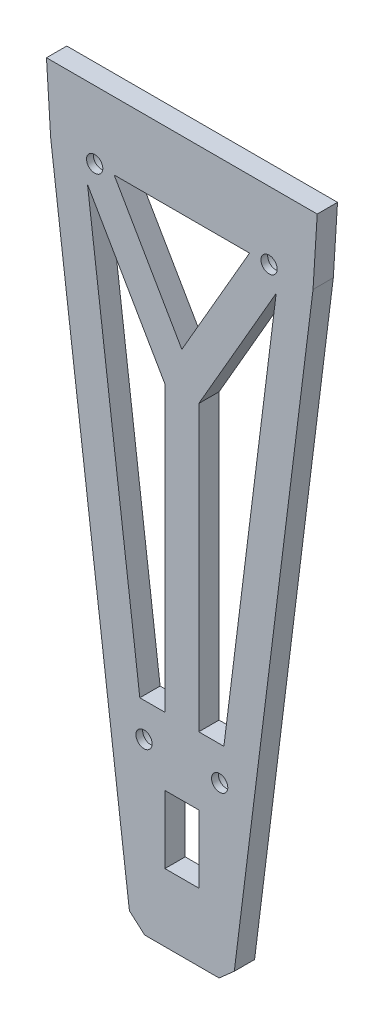
ISO-10303-21;
HEADER;
FILE_DESCRIPTION(('STEP AP214'),'2;1');
FILE_NAME('part.step','',(''),(''),'','','');
FILE_SCHEMA(('AUTOMOTIVE_DESIGN { 1 0 10303 214 1 1 1 1 }'));
ENDSEC;
DATA;
#1=APPLICATION_CONTEXT('core data for automotive mechanical design processes');
#2=APPLICATION_PROTOCOL_DEFINITION('international standard','automotive_design',2000,#1);
#3=PRODUCT_CONTEXT('',#1,'mechanical');
#4=PRODUCT('Part','Part','',(#3));
#5=PRODUCT_RELATED_PRODUCT_CATEGORY('part','',(#4));
#6=PRODUCT_DEFINITION_FORMATION('','',#4);
#7=PRODUCT_DEFINITION_CONTEXT('part definition',#1,'design');
#8=PRODUCT_DEFINITION('design','',#6,#7);
#9=PRODUCT_DEFINITION_SHAPE('','',#8);
#10=(LENGTH_UNIT() NAMED_UNIT(*) SI_UNIT(.MILLI.,.METRE.));
#11=(NAMED_UNIT(*) PLANE_ANGLE_UNIT() SI_UNIT($,.RADIAN.));
#12=(NAMED_UNIT(*) SI_UNIT($,.STERADIAN.) SOLID_ANGLE_UNIT());
#13=UNCERTAINTY_MEASURE_WITH_UNIT(LENGTH_MEASURE(1.E-05),#10,'distance_accuracy_value','');
#14=(GEOMETRIC_REPRESENTATION_CONTEXT(3) GLOBAL_UNCERTAINTY_ASSIGNED_CONTEXT((#13)) GLOBAL_UNIT_ASSIGNED_CONTEXT((#10,
#11,#12)) REPRESENTATION_CONTEXT('',''));
#15=CARTESIAN_POINT('',(0.,0.,0.));
#16=DIRECTION('',(0.,0.,1.));
#17=DIRECTION('',(1.,0.,0.));
#18=AXIS2_PLACEMENT_3D('',#15,#16,#17);
#19=CARTESIAN_POINT('',(-19.3798263270539,-4.96138938357014,3.));
#20=DIRECTION('',(0.99806760209759,0.0621374415563304,0.));
#21=DIRECTION('',(-0.0621374415563304,0.99806760209759,0.));
#22=AXIS2_PLACEMENT_3D('',#19,#20,#21);
#23=PLANE('',#22);
#24=DIRECTION('',(0.0621374415563304,-0.99806760209759,0.));
#25=VECTOR('',#24,1.);
#26=CARTESIAN_POINT('',(-19.3798263270539,-4.96138938357014,0.));
#27=LINE('',#26,#25);
#28=CARTESIAN_POINT('',(-20.0000000000001,5.,0.));
#29=VERTEX_POINT('',#28);
#30=CARTESIAN_POINT('',(-19.3798263270539,-4.96138938357014,0.));
#31=VERTEX_POINT('',#30);
#32=EDGE_CURVE('E202',#29,#31,#27,.T.);
#33=ORIENTED_EDGE('',*,*,#32,.T.);
#34=DIRECTION('',(0.,0.,-1.));
#35=VECTOR('',#34,1.);
#36=CARTESIAN_POINT('',(-19.3798263270539,-4.96138938357014,3.));
#37=LINE('',#36,#35);
#38=CARTESIAN_POINT('',(-19.3798263270539,-4.96138938357014,3.));
#39=VERTEX_POINT('',#38);
#40=EDGE_CURVE('E40',#39,#31,#37,.T.);
#41=ORIENTED_EDGE('',*,*,#40,.F.);
#42=DIRECTION('',(0.0621374415563304,-0.99806760209759,0.));
#43=VECTOR('',#42,1.);
#44=CARTESIAN_POINT('',(-19.3798263270539,-4.96138938357014,3.));
#45=LINE('',#44,#43);
#46=CARTESIAN_POINT('',(-20.0000000000001,5.,3.));
#47=VERTEX_POINT('',#46);
#48=EDGE_CURVE('E204',#47,#39,#45,.T.);
#49=ORIENTED_EDGE('',*,*,#48,.F.);
#50=DIRECTION('',(0.,0.,-1.));
#51=VECTOR('',#50,1.);
#52=CARTESIAN_POINT('',(-20.,4.99999999999819,3.));
#53=LINE('',#52,#51);
#54=EDGE_CURVE('E11',#47,#29,#53,.T.);
#55=ORIENTED_EDGE('',*,*,#54,.T.);
#56=EDGE_LOOP('',(#33,#41,#49,#55));
#57=FACE_BOUND('',#56,.T.);
#58=ADVANCED_FACE('F33',(#57),#23,.F.);
#59=CARTESIAN_POINT('',(-7.74806946918249,-98.0154442465732,3.));
#60=DIRECTION('',(0.992277876713673,0.124034734589167,0.));
#61=DIRECTION('',(-0.124034734589167,0.992277876713673,0.));
#62=AXIS2_PLACEMENT_3D('',#59,#60,#61);
#63=PLANE('',#62);
#64=DIRECTION('',(0.124034734589167,-0.992277876713673,0.));
#65=VECTOR('',#64,1.);
#66=CARTESIAN_POINT('',(-7.74806946918249,-98.0154442465732,0.));
#67=LINE('',#66,#65);
#68=CARTESIAN_POINT('',(-7.74806946918249,-98.0154442465732,0.));
#69=VERTEX_POINT('',#68);
#70=EDGE_CURVE('E209',#31,#69,#67,.T.);
#71=ORIENTED_EDGE('',*,*,#70,.T.);
#72=DIRECTION('',(0.,0.,-1.));
#73=VECTOR('',#72,1.);
#74=CARTESIAN_POINT('',(-7.74806946918249,-98.0154442465732,3.));
#75=LINE('',#74,#73);
#76=CARTESIAN_POINT('',(-7.74806946918249,-98.0154442465732,3.));
#77=VERTEX_POINT('',#76);
#78=EDGE_CURVE('E243',#77,#69,#75,.T.);
#79=ORIENTED_EDGE('',*,*,#78,.F.);
#80=DIRECTION('',(0.124034734589167,-0.992277876713673,0.));
#81=VECTOR('',#80,1.);
#82=CARTESIAN_POINT('',(-7.74806946918249,-98.0154442465732,3.));
#83=LINE('',#82,#81);
#84=EDGE_CURVE('E249',#39,#77,#83,.T.);
#85=ORIENTED_EDGE('',*,*,#84,.F.);
#86=ORIENTED_EDGE('',*,*,#40,.T.);
#87=EDGE_LOOP('',(#71,#79,#85,#86));
#88=FACE_BOUND('',#87,.T.);
#89=ADVANCED_FACE('F247',(#88),#63,.F.);
#90=CARTESIAN_POINT('',(-5.50000000000416,-100.000000000001,3.));
#91=DIRECTION('',(0.661802563235756,0.749678175815852,0.));
#92=DIRECTION('',(-0.749678175815852,0.661802563235756,0.));
#93=AXIS2_PLACEMENT_3D('',#90,#91,#92);
#94=PLANE('',#93);
#95=DIRECTION('',(0.749678175815852,-0.661802563235756,0.));
#96=VECTOR('',#95,1.);
#97=CARTESIAN_POINT('',(-5.50000000000416,-100.000000000001,0.));
#98=LINE('',#97,#96);
#99=CARTESIAN_POINT('',(-5.50000000000416,-100.000000000001,0.));
#100=VERTEX_POINT('',#99);
#101=EDGE_CURVE('E212',#69,#100,#98,.T.);
#102=ORIENTED_EDGE('',*,*,#101,.T.);
#103=DIRECTION('',(0.,0.,-1.));
#104=VECTOR('',#103,1.);
#105=CARTESIAN_POINT('',(-5.50000000000416,-100.000000000001,3.));
#106=LINE('',#105,#104);
#107=CARTESIAN_POINT('',(-5.50000000000416,-100.000000000001,3.));
#108=VERTEX_POINT('',#107);
#109=EDGE_CURVE('E240',#108,#100,#106,.T.);
#110=ORIENTED_EDGE('',*,*,#109,.F.);
#111=DIRECTION('',(0.749678175815852,-0.661802563235756,0.));
#112=VECTOR('',#111,1.);
#113=CARTESIAN_POINT('',(-5.50000000000416,-100.000000000001,3.));
#114=LINE('',#113,#112);
#115=EDGE_CURVE('E252',#77,#108,#114,.T.);
#116=ORIENTED_EDGE('',*,*,#115,.F.);
#117=ORIENTED_EDGE('',*,*,#78,.T.);
#118=EDGE_LOOP('',(#102,#110,#116,#117));
#119=FACE_BOUND('',#118,.T.);
#120=ADVANCED_FACE('F283',(#119),#94,.F.);
#121=CARTESIAN_POINT('',(5.49999999999584,-100.000000000001,3.));
#122=DIRECTION('',(0.,1.,0.));
#123=DIRECTION('',(0.,0.,1.));
#124=AXIS2_PLACEMENT_3D('',#121,#122,#123);
#125=PLANE('',#124);
#126=DIRECTION('',(1.,0.,0.));
#127=VECTOR('',#126,1.);
#128=CARTESIAN_POINT('',(5.49999999999584,-100.000000000001,0.));
#129=LINE('',#128,#127);
#130=CARTESIAN_POINT('',(5.49999999999584,-100.000000000001,0.));
#131=VERTEX_POINT('',#130);
#132=EDGE_CURVE('E222',#100,#131,#129,.T.);
#133=ORIENTED_EDGE('',*,*,#132,.T.);
#134=DIRECTION('',(0.,0.,-1.));
#135=VECTOR('',#134,1.);
#136=CARTESIAN_POINT('',(5.49999999999584,-100.000000000001,3.));
#137=LINE('',#136,#135);
#138=CARTESIAN_POINT('',(5.49999999999584,-100.000000000001,3.));
#139=VERTEX_POINT('',#138);
#140=EDGE_CURVE('E237',#139,#131,#137,.T.);
#141=ORIENTED_EDGE('',*,*,#140,.F.);
#142=DIRECTION('',(1.,0.,0.));
#143=VECTOR('',#142,1.);
#144=CARTESIAN_POINT('',(5.49999999999584,-100.000000000001,3.));
#145=LINE('',#144,#143);
#146=EDGE_CURVE('E254',#108,#139,#145,.T.);
#147=ORIENTED_EDGE('',*,*,#146,.F.);
#148=ORIENTED_EDGE('',*,*,#109,.T.);
#149=EDGE_LOOP('',(#133,#141,#147,#148));
#150=FACE_BOUND('',#149,.T.);
#151=ADVANCED_FACE('F280',(#150),#125,.F.);
#152=CARTESIAN_POINT('',(7.74806946917434,-98.0154442465732,3.));
#153=DIRECTION('',(-0.661802563235723,0.749678175815881,0.));
#154=DIRECTION('',(-0.749678175815881,-0.661802563235723,0.));
#155=AXIS2_PLACEMENT_3D('',#152,#153,#154);
#156=PLANE('',#155);
#157=DIRECTION('',(0.749678175815881,0.661802563235723,0.));
#158=VECTOR('',#157,1.);
#159=CARTESIAN_POINT('',(7.74806946917434,-98.0154442465732,0.));
#160=LINE('',#159,#158);
#161=CARTESIAN_POINT('',(7.74806946917434,-98.0154442465732,0.));
#162=VERTEX_POINT('',#161);
#163=EDGE_CURVE('E224',#131,#162,#160,.T.);
#164=ORIENTED_EDGE('',*,*,#163,.T.);
#165=DIRECTION('',(0.,0.,-1.));
#166=VECTOR('',#165,1.);
#167=CARTESIAN_POINT('',(7.74806946917434,-98.0154442465732,3.));
#168=LINE('',#167,#166);
#169=CARTESIAN_POINT('',(7.74806946917434,-98.0154442465732,3.));
#170=VERTEX_POINT('',#169);
#171=EDGE_CURVE('E234',#170,#162,#168,.T.);
#172=ORIENTED_EDGE('',*,*,#171,.F.);
#173=DIRECTION('',(0.749678175815881,0.661802563235723,0.));
#174=VECTOR('',#173,1.);
#175=CARTESIAN_POINT('',(7.74806946917434,-98.0154442465732,3.));
#176=LINE('',#175,#174);
#177=EDGE_CURVE('E259',#139,#170,#176,.T.);
#178=ORIENTED_EDGE('',*,*,#177,.F.);
#179=ORIENTED_EDGE('',*,*,#140,.T.);
#180=EDGE_LOOP('',(#164,#172,#178,#179));
#181=FACE_BOUND('',#180,.T.);
#182=ADVANCED_FACE('F276',(#181),#156,.F.);
#183=CARTESIAN_POINT('',(19.3798263270541,-4.96138938356831,3.));
#184=DIRECTION('',(-0.992277876713662,0.124034734589252,0.));
#185=DIRECTION('',(-0.124034734589252,-0.992277876713662,0.));
#186=AXIS2_PLACEMENT_3D('',#183,#184,#185);
#187=PLANE('',#186);
#188=DIRECTION('',(0.124034734589252,0.992277876713662,0.));
#189=VECTOR('',#188,1.);
#190=CARTESIAN_POINT('',(19.3798263270541,-4.96138938356831,0.));
#191=LINE('',#190,#189);
#192=CARTESIAN_POINT('',(19.3798263270541,-4.96138938356831,0.));
#193=VERTEX_POINT('',#192);
#194=EDGE_CURVE('E226',#162,#193,#191,.T.);
#195=ORIENTED_EDGE('',*,*,#194,.T.);
#196=DIRECTION('',(0.,0.,-1.));
#197=VECTOR('',#196,1.);
#198=CARTESIAN_POINT('',(19.3798263270541,-4.96138938356831,3.));
#199=LINE('',#198,#197);
#200=CARTESIAN_POINT('',(19.3798263270541,-4.96138938356831,3.));
#201=VERTEX_POINT('',#200);
#202=EDGE_CURVE('E231',#201,#193,#199,.T.);
#203=ORIENTED_EDGE('',*,*,#202,.F.);
#204=DIRECTION('',(0.124034734589252,0.992277876713662,0.));
#205=VECTOR('',#204,1.);
#206=CARTESIAN_POINT('',(19.3798263270541,-4.96138938356831,3.));
#207=LINE('',#206,#205);
#208=EDGE_CURVE('E260',#170,#201,#207,.T.);
#209=ORIENTED_EDGE('',*,*,#208,.F.);
#210=ORIENTED_EDGE('',*,*,#171,.T.);
#211=EDGE_LOOP('',(#195,#203,#209,#210));
#212=FACE_BOUND('',#211,.T.);
#213=ADVANCED_FACE('F272',(#212),#187,.F.);
#214=CARTESIAN_POINT('',(19.3798263270541,-4.96138938356831,3.));
#215=DIRECTION('',(-0.998067602097589,0.0621374415563443,0.));
#216=DIRECTION('',(-0.0621374415563444,-0.998067602097589,0.));
#217=AXIS2_PLACEMENT_3D('',#214,#215,#216);
#218=PLANE('',#217);
#219=DIRECTION('',(0.0621374415563443,0.998067602097589,0.));
#220=VECTOR('',#219,1.);
#221=CARTESIAN_POINT('',(19.3798263270541,-4.96138938356831,0.));
#222=LINE('',#221,#220);
#223=CARTESIAN_POINT('',(20.0000000000003,5.,0.));
#224=VERTEX_POINT('',#223);
#225=EDGE_CURVE('E228',#193,#224,#222,.T.);
#226=ORIENTED_EDGE('',*,*,#225,.T.);
#227=DIRECTION('',(0.,0.,-1.));
#228=VECTOR('',#227,1.);
#229=CARTESIAN_POINT('',(20.0000000000003,5.,3.));
#230=LINE('',#229,#228);
#231=CARTESIAN_POINT('',(20.0000000000003,5.,3.));
#232=VERTEX_POINT('',#231);
#233=EDGE_CURVE('E192',#232,#224,#230,.T.);
#234=ORIENTED_EDGE('',*,*,#233,.F.);
#235=DIRECTION('',(0.0621374415563443,0.998067602097589,0.));
#236=VECTOR('',#235,1.);
#237=CARTESIAN_POINT('',(19.3798263270541,-4.96138938356831,3.));
#238=LINE('',#237,#236);
#239=EDGE_CURVE('E218',#201,#232,#238,.T.);
#240=ORIENTED_EDGE('',*,*,#239,.F.);
#241=ORIENTED_EDGE('',*,*,#202,.T.);
#242=EDGE_LOOP('',(#226,#234,#240,#241));
#243=FACE_BOUND('',#242,.T.);
#244=ADVANCED_FACE('F267',(#243),#218,.F.);
#245=CARTESIAN_POINT('',(0.,0.,3.));
#246=DIRECTION('',(0.,0.,-1.));
#247=DIRECTION('',(-1.,0.,0.));
#248=AXIS2_PLACEMENT_3D('',#245,#246,#247);
#249=PLANE('',#248);
#250=CARTESIAN_POINT('',(12.8800207079902,-5.01165780691051,3.));
#251=DIRECTION('',(0.,0.,-1.));
#252=DIRECTION('',(-1.,0.,0.));
#253=AXIS2_PLACEMENT_3D('',#250,#251,#252);
#254=CIRCLE('',#253,1.2);
#255=CARTESIAN_POINT('',(11.6800207079902,-5.01165780691051,3.));
#256=VERTEX_POINT('',#255);
#257=EDGE_CURVE('E632',#256,#256,#254,.T.);
#258=ORIENTED_EDGE('',*,*,#257,.T.);
#259=EDGE_LOOP('',(#258));
#260=FACE_BOUND('',#259,.T.);
#261=CARTESIAN_POINT('',(-12.8800207079902,-5.01165780691048,3.));
#262=DIRECTION('',(0.,0.,-1.));
#263=DIRECTION('',(-1.,0.,0.));
#264=AXIS2_PLACEMENT_3D('',#261,#262,#263);
#265=CIRCLE('',#264,1.2);
#266=CARTESIAN_POINT('',(-14.0800207079902,-5.01165780691048,3.));
#267=VERTEX_POINT('',#266);
#268=EDGE_CURVE('E636',#267,#267,#265,.T.);
#269=ORIENTED_EDGE('',*,*,#268,.T.);
#270=EDGE_LOOP('',(#269));
#271=FACE_BOUND('',#270,.T.);
#272=CARTESIAN_POINT('',(5.58608890731039,-75.,3.));
#273=DIRECTION('',(0.,0.,-1.));
#274=DIRECTION('',(-1.,0.,0.));
#275=AXIS2_PLACEMENT_3D('',#272,#273,#274);
#276=CIRCLE('',#275,1.2);
#277=CARTESIAN_POINT('',(4.38608890731039,-75.,3.));
#278=VERTEX_POINT('',#277);
#279=EDGE_CURVE('E640',#278,#278,#276,.T.);
#280=ORIENTED_EDGE('',*,*,#279,.T.);
#281=EDGE_LOOP('',(#280));
#282=FACE_BOUND('',#281,.T.);
#283=CARTESIAN_POINT('',(-5.5860889073166,-75.,3.));
#284=DIRECTION('',(0.,0.,-1.));
#285=DIRECTION('',(-1.,0.,0.));
#286=AXIS2_PLACEMENT_3D('',#283,#284,#285);
#287=CIRCLE('',#286,1.2);
#288=CARTESIAN_POINT('',(-6.7860889073166,-75.,3.));
#289=VERTEX_POINT('',#288);
#290=EDGE_CURVE('E644',#289,#289,#287,.T.);
#291=ORIENTED_EDGE('',*,*,#290,.T.);
#292=EDGE_LOOP('',(#291));
#293=FACE_BOUND('',#292,.T.);
#294=DIRECTION('',(0.,-1.,0.));
#295=VECTOR('',#294,1.);
#296=CARTESIAN_POINT('',(-2.49999999999999,-90.0000000000005,3.));
#297=LINE('',#296,#295);
#298=CARTESIAN_POINT('',(-2.49999999999999,-80.0000000000005,3.));
#299=VERTEX_POINT('',#298);
#300=CARTESIAN_POINT('',(-2.49999999999999,-90.0000000000005,3.));
#301=VERTEX_POINT('',#300);
#302=EDGE_CURVE('E649',#299,#301,#297,.T.);
#303=ORIENTED_EDGE('',*,*,#302,.F.);
#304=DIRECTION('',(-1.,0.,0.));
#305=VECTOR('',#304,1.);
#306=CARTESIAN_POINT('',(2.50000000000001,-80.0000000000005,3.));
#307=LINE('',#306,#305);
#308=CARTESIAN_POINT('',(2.50000000000001,-80.0000000000005,3.));
#309=VERTEX_POINT('',#308);
#310=EDGE_CURVE('E47',#309,#299,#307,.T.);
#311=ORIENTED_EDGE('',*,*,#310,.F.);
#312=DIRECTION('',(0.,1.,0.));
#313=VECTOR('',#312,1.);
#314=CARTESIAN_POINT('',(2.50000000000001,-90.0000000000005,3.));
#315=LINE('',#314,#313);
#316=CARTESIAN_POINT('',(2.50000000000001,-90.0000000000005,3.));
#317=VERTEX_POINT('',#316);
#318=EDGE_CURVE('E728',#317,#309,#315,.T.);
#319=ORIENTED_EDGE('',*,*,#318,.F.);
#320=DIRECTION('',(1.,0.,0.));
#321=VECTOR('',#320,1.);
#322=CARTESIAN_POINT('',(2.50000000000001,-90.0000000000005,3.));
#323=LINE('',#322,#321);
#324=EDGE_CURVE('E735',#301,#317,#323,.T.);
#325=ORIENTED_EDGE('',*,*,#324,.F.);
#326=EDGE_LOOP('',(#303,#311,#319,#325));
#327=FACE_BOUND('',#326,.T.);
#328=DIRECTION('',(0.,1.,0.));
#329=VECTOR('',#328,1.);
#330=CARTESIAN_POINT('',(-2.49999999999999,-27.9903810567666,3.));
#331=LINE('',#330,#329);
#332=CARTESIAN_POINT('',(-2.49999999999999,-70.,3.));
#333=VERTEX_POINT('',#332);
#334=CARTESIAN_POINT('',(-2.49999999999999,-27.9903810567666,3.));
#335=VERTEX_POINT('',#334);
#336=EDGE_CURVE('E654',#333,#335,#331,.T.);
#337=ORIENTED_EDGE('',*,*,#336,.F.);
#338=DIRECTION('',(1.,0.,0.));
#339=VECTOR('',#338,1.);
#340=CARTESIAN_POINT('',(-2.49999999999999,-70.,3.));
#341=LINE('',#340,#339);
#342=CARTESIAN_POINT('',(-6.21108890731639,-70.,3.));
#343=VERTEX_POINT('',#342);
#344=EDGE_CURVE('E55',#343,#333,#341,.T.);
#345=ORIENTED_EDGE('',*,*,#344,.F.);
#346=DIRECTION('',(0.124034734589167,-0.992277876713673,0.));
#347=VECTOR('',#346,1.);
#348=CARTESIAN_POINT('',(-13.9388818416593,-8.17765652523557,3.));
#349=LINE('',#348,#347);
#350=CARTESIAN_POINT('',(-13.9388818416593,-8.17765652523557,3.));
#351=VERTEX_POINT('',#350);
#352=EDGE_CURVE('E755',#351,#343,#349,.T.);
#353=ORIENTED_EDGE('',*,*,#352,.F.);
#354=DIRECTION('',(-0.500000000000001,0.866025403784438,0.));
#355=VECTOR('',#354,1.);
#356=CARTESIAN_POINT('',(-13.9388818416593,-8.17765652523557,3.));
#357=LINE('',#356,#355);
#358=EDGE_CURVE('E762',#335,#351,#357,.T.);
#359=ORIENTED_EDGE('',*,*,#358,.F.);
#360=EDGE_LOOP('',(#337,#345,#353,#359));
#361=FACE_BOUND('',#360,.T.);
#362=DIRECTION('',(1.,0.,0.));
#363=VECTOR('',#362,1.);
#364=CARTESIAN_POINT('',(6.21108890731062,-70.,3.));
#365=LINE('',#364,#363);
#366=CARTESIAN_POINT('',(2.5,-70.,3.));
#367=VERTEX_POINT('',#366);
#368=CARTESIAN_POINT('',(6.21108890731062,-70.,3.));
#369=VERTEX_POINT('',#368);
#370=EDGE_CURVE('E660',#367,#369,#365,.T.);
#371=ORIENTED_EDGE('',*,*,#370,.F.);
#372=DIRECTION('',(0.,-1.,0.));
#373=VECTOR('',#372,1.);
#374=CARTESIAN_POINT('',(2.50000000000001,-27.9903810567666,3.));
#375=LINE('',#374,#373);
#376=CARTESIAN_POINT('',(2.50000000000001,-27.9903810567666,3.));
#377=VERTEX_POINT('',#376);
#378=EDGE_CURVE('E708',#377,#367,#375,.T.);
#379=ORIENTED_EDGE('',*,*,#378,.F.);
#380=DIRECTION('',(-0.500000000000001,-0.866025403784438,0.));
#381=VECTOR('',#380,1.);
#382=CARTESIAN_POINT('',(2.50000000000001,-27.9903810567666,3.));
#383=LINE('',#382,#381);
#384=CARTESIAN_POINT('',(13.9388818416588,-8.17765652523652,3.));
#385=VERTEX_POINT('',#384);
#386=EDGE_CURVE('E697',#385,#377,#383,.T.);
#387=ORIENTED_EDGE('',*,*,#386,.F.);
#388=DIRECTION('',(0.124034734589252,0.992277876713662,0.));
#389=VECTOR('',#388,1.);
#390=CARTESIAN_POINT('',(6.21108890731062,-70.,3.));
#391=LINE('',#390,#389);
#392=EDGE_CURVE('E704',#369,#385,#391,.T.);
#393=ORIENTED_EDGE('',*,*,#392,.F.);
#394=EDGE_LOOP('',(#371,#379,#387,#393));
#395=FACE_BOUND('',#394,.T.);
#396=DIRECTION('',(0.5,0.866025403784439,0.));
#397=VECTOR('',#396,1.);
#398=CARTESIAN_POINT('',(0.,-22.3205080756888,3.));
#399=LINE('',#398,#397);
#400=CARTESIAN_POINT('',(0.,-22.3205080756888,3.));
#401=VERTEX_POINT('',#400);
#402=CARTESIAN_POINT('',(10.,-5.,3.));
#403=VERTEX_POINT('',#402);
#404=EDGE_CURVE('E665',#401,#403,#399,.T.);
#405=ORIENTED_EDGE('',*,*,#404,.F.);
#406=DIRECTION('',(0.5,-0.866025403784439,0.));
#407=VECTOR('',#406,1.);
#408=CARTESIAN_POINT('',(-10.,-5.,3.));
#409=LINE('',#408,#407);
#410=CARTESIAN_POINT('',(-10.,-5.,3.));
#411=VERTEX_POINT('',#410);
#412=EDGE_CURVE('E666',#411,#401,#409,.T.);
#413=ORIENTED_EDGE('',*,*,#412,.F.);
#414=DIRECTION('',(-1.,0.,0.));
#415=VECTOR('',#414,1.);
#416=CARTESIAN_POINT('',(10.,-5.,3.));
#417=LINE('',#416,#415);
#418=EDGE_CURVE('E668',#403,#411,#417,.T.);
#419=ORIENTED_EDGE('',*,*,#418,.F.);
#420=EDGE_LOOP('',(#405,#413,#419));
#421=FACE_BOUND('',#420,.T.);
#422=ORIENTED_EDGE('',*,*,#239,.T.);
#423=DIRECTION('',(-1.,0.,0.));
#424=VECTOR('',#423,1.);
#425=CARTESIAN_POINT('',(0.,5.,3.));
#426=LINE('',#425,#424);
#427=EDGE_CURVE('E197',#232,#47,#426,.T.);
#428=ORIENTED_EDGE('',*,*,#427,.T.);
#429=ORIENTED_EDGE('',*,*,#48,.T.);
#430=ORIENTED_EDGE('',*,*,#84,.T.);
#431=ORIENTED_EDGE('',*,*,#115,.T.);
#432=ORIENTED_EDGE('',*,*,#146,.T.);
#433=ORIENTED_EDGE('',*,*,#177,.T.);
#434=ORIENTED_EDGE('',*,*,#208,.T.);
#435=EDGE_LOOP('',(#422,#428,#429,#430,#431,#432,#433,#434));
#436=FACE_BOUND('',#435,.T.);
#437=ADVANCED_FACE('F265',(#260,#271,#282,#293,#327,#361,#395,#421,#436),#249,.F.);
#438=CARTESIAN_POINT('',(0.,0.,0.));
#439=DIRECTION('',(0.,0.,-1.));
#440=DIRECTION('',(-1.,0.,0.));
#441=AXIS2_PLACEMENT_3D('',#438,#439,#440);
#442=PLANE('',#441);
#443=DIRECTION('',(-1.,0.,0.));
#444=VECTOR('',#443,1.);
#445=CARTESIAN_POINT('',(20.0000000000003,5.,0.));
#446=LINE('',#445,#444);
#447=EDGE_CURVE('E188',#224,#29,#446,.T.);
#448=ORIENTED_EDGE('',*,*,#447,.F.);
#449=ORIENTED_EDGE('',*,*,#225,.F.);
#450=ORIENTED_EDGE('',*,*,#194,.F.);
#451=ORIENTED_EDGE('',*,*,#163,.F.);
#452=ORIENTED_EDGE('',*,*,#132,.F.);
#453=ORIENTED_EDGE('',*,*,#101,.F.);
#454=ORIENTED_EDGE('',*,*,#70,.F.);
#455=ORIENTED_EDGE('',*,*,#32,.F.);
#456=EDGE_LOOP('',(#448,#449,#450,#451,#452,#453,#454,#455));
#457=FACE_BOUND('',#456,.T.);
#458=CARTESIAN_POINT('',(12.8800207079902,-5.01165780691051,0.));
#459=DIRECTION('',(0.,0.,-1.));
#460=DIRECTION('',(-1.,0.,0.));
#461=AXIS2_PLACEMENT_3D('',#458,#459,#460);
#462=CIRCLE('',#461,2.19999999999999);
#463=CARTESIAN_POINT('',(10.6800207079902,-5.01165780691051,0.));
#464=VERTEX_POINT('',#463);
#465=EDGE_CURVE('E812',#464,#464,#462,.T.);
#466=ORIENTED_EDGE('',*,*,#465,.F.);
#467=EDGE_LOOP('',(#466));
#468=FACE_BOUND('',#467,.T.);
#469=CARTESIAN_POINT('',(-12.8800207079902,-5.01165780691048,0.));
#470=DIRECTION('',(0.,0.,-1.));
#471=DIRECTION('',(-1.,0.,0.));
#472=AXIS2_PLACEMENT_3D('',#469,#470,#471);
#473=CIRCLE('',#472,2.19999999999999);
#474=CARTESIAN_POINT('',(-15.0800207079902,-5.01165780691048,0.));
#475=VERTEX_POINT('',#474);
#476=EDGE_CURVE('E802',#475,#475,#473,.T.);
#477=ORIENTED_EDGE('',*,*,#476,.F.);
#478=EDGE_LOOP('',(#477));
#479=FACE_BOUND('',#478,.T.);
#480=CARTESIAN_POINT('',(5.58608890731039,-75.,0.));
#481=DIRECTION('',(0.,0.,-1.));
#482=DIRECTION('',(-1.,0.,0.));
#483=AXIS2_PLACEMENT_3D('',#480,#481,#482);
#484=CIRCLE('',#483,2.2);
#485=CARTESIAN_POINT('',(3.3860889073104,-75.,0.));
#486=VERTEX_POINT('',#485);
#487=EDGE_CURVE('E792',#486,#486,#484,.T.);
#488=ORIENTED_EDGE('',*,*,#487,.F.);
#489=EDGE_LOOP('',(#488));
#490=FACE_BOUND('',#489,.T.);
#491=CARTESIAN_POINT('',(-5.5860889073166,-75.,0.));
#492=DIRECTION('',(0.,0.,-1.));
#493=DIRECTION('',(-1.,0.,0.));
#494=AXIS2_PLACEMENT_3D('',#491,#492,#493);
#495=CIRCLE('',#494,2.2);
#496=CARTESIAN_POINT('',(-7.7860889073166,-75.,0.));
#497=VERTEX_POINT('',#496);
#498=EDGE_CURVE('E782',#497,#497,#495,.T.);
#499=ORIENTED_EDGE('',*,*,#498,.F.);
#500=EDGE_LOOP('',(#499));
#501=FACE_BOUND('',#500,.T.);
#502=DIRECTION('',(-1.,0.,0.));
#503=VECTOR('',#502,1.);
#504=CARTESIAN_POINT('',(2.50000000000001,-80.0000000000005,0.));
#505=LINE('',#504,#503);
#506=CARTESIAN_POINT('',(2.50000000000001,-80.0000000000005,0.));
#507=VERTEX_POINT('',#506);
#508=CARTESIAN_POINT('',(-2.49999999999999,-80.0000000000005,0.));
#509=VERTEX_POINT('',#508);
#510=EDGE_CURVE('E740',#507,#509,#505,.T.);
#511=ORIENTED_EDGE('',*,*,#510,.T.);
#512=DIRECTION('',(0.,-1.,0.));
#513=VECTOR('',#512,1.);
#514=CARTESIAN_POINT('',(-2.49999999999999,-90.0000000000005,0.));
#515=LINE('',#514,#513);
#516=CARTESIAN_POINT('',(-2.49999999999999,-90.0000000000005,0.));
#517=VERTEX_POINT('',#516);
#518=EDGE_CURVE('E720',#509,#517,#515,.T.);
#519=ORIENTED_EDGE('',*,*,#518,.T.);
#520=DIRECTION('',(1.,0.,0.));
#521=VECTOR('',#520,1.);
#522=CARTESIAN_POINT('',(2.50000000000001,-90.0000000000005,0.));
#523=LINE('',#522,#521);
#524=CARTESIAN_POINT('',(2.50000000000001,-90.0000000000005,0.));
#525=VERTEX_POINT('',#524);
#526=EDGE_CURVE('E746',#517,#525,#523,.T.);
#527=ORIENTED_EDGE('',*,*,#526,.T.);
#528=DIRECTION('',(0.,1.,0.));
#529=VECTOR('',#528,1.);
#530=CARTESIAN_POINT('',(2.50000000000001,-90.0000000000005,0.));
#531=LINE('',#530,#529);
#532=EDGE_CURVE('E743',#525,#507,#531,.T.);
#533=ORIENTED_EDGE('',*,*,#532,.T.);
#534=EDGE_LOOP('',(#511,#519,#527,#533));
#535=FACE_BOUND('',#534,.T.);
#536=DIRECTION('',(1.,0.,0.));
#537=VECTOR('',#536,1.);
#538=CARTESIAN_POINT('',(-2.49999999999999,-70.,0.));
#539=LINE('',#538,#537);
#540=CARTESIAN_POINT('',(-6.21108890731639,-70.,0.));
#541=VERTEX_POINT('',#540);
#542=CARTESIAN_POINT('',(-2.49999999999999,-70.,0.));
#543=VERTEX_POINT('',#542);
#544=EDGE_CURVE('E767',#541,#543,#539,.T.);
#545=ORIENTED_EDGE('',*,*,#544,.T.);
#546=DIRECTION('',(0.,1.,0.));
#547=VECTOR('',#546,1.);
#548=CARTESIAN_POINT('',(-2.49999999999999,-27.9903810567666,0.));
#549=LINE('',#548,#547);
#550=CARTESIAN_POINT('',(-2.49999999999999,-27.9903810567666,0.));
#551=VERTEX_POINT('',#550);
#552=EDGE_CURVE('E719',#543,#551,#549,.T.);
#553=ORIENTED_EDGE('',*,*,#552,.T.);
#554=DIRECTION('',(-0.500000000000001,0.866025403784438,0.));
#555=VECTOR('',#554,1.);
#556=CARTESIAN_POINT('',(-13.9388818416593,-8.17765652523557,0.));
#557=LINE('',#556,#555);
#558=CARTESIAN_POINT('',(-13.9388818416593,-8.17765652523557,0.));
#559=VERTEX_POINT('',#558);
#560=EDGE_CURVE('E723',#551,#559,#557,.T.);
#561=ORIENTED_EDGE('',*,*,#560,.T.);
#562=DIRECTION('',(0.124034734589167,-0.992277876713673,0.));
#563=VECTOR('',#562,1.);
#564=CARTESIAN_POINT('',(-13.9388818416593,-8.17765652523557,0.));
#565=LINE('',#564,#563);
#566=EDGE_CURVE('E770',#559,#541,#565,.T.);
#567=ORIENTED_EDGE('',*,*,#566,.T.);
#568=EDGE_LOOP('',(#545,#553,#561,#567));
#569=FACE_BOUND('',#568,.T.);
#570=DIRECTION('',(0.,-1.,0.));
#571=VECTOR('',#570,1.);
#572=CARTESIAN_POINT('',(2.50000000000001,-27.9903810567666,0.));
#573=LINE('',#572,#571);
#574=CARTESIAN_POINT('',(2.5,-27.9903810567666,0.));
#575=VERTEX_POINT('',#574);
#576=CARTESIAN_POINT('',(2.5,-70.,0.));
#577=VERTEX_POINT('',#576);
#578=EDGE_CURVE('E710',#575,#577,#573,.T.);
#579=ORIENTED_EDGE('',*,*,#578,.T.);
#580=DIRECTION('',(1.,0.,0.));
#581=VECTOR('',#580,1.);
#582=CARTESIAN_POINT('',(6.21108890731062,-70.,0.));
#583=LINE('',#582,#581);
#584=CARTESIAN_POINT('',(6.21108890731062,-70.,0.));
#585=VERTEX_POINT('',#584);
#586=EDGE_CURVE('E687',#577,#585,#583,.T.);
#587=ORIENTED_EDGE('',*,*,#586,.T.);
#588=DIRECTION('',(0.124034734589252,0.992277876713662,0.));
#589=VECTOR('',#588,1.);
#590=CARTESIAN_POINT('',(6.21108890731062,-70.,0.));
#591=LINE('',#590,#589);
#592=CARTESIAN_POINT('',(13.9388818416588,-8.17765652523651,0.));
#593=VERTEX_POINT('',#592);
#594=EDGE_CURVE('E716',#585,#593,#591,.T.);
#595=ORIENTED_EDGE('',*,*,#594,.T.);
#596=DIRECTION('',(-0.500000000000001,-0.866025403784438,0.));
#597=VECTOR('',#596,1.);
#598=CARTESIAN_POINT('',(2.50000000000001,-27.9903810567666,0.));
#599=LINE('',#598,#597);
#600=EDGE_CURVE('E713',#593,#575,#599,.T.);
#601=ORIENTED_EDGE('',*,*,#600,.T.);
#602=EDGE_LOOP('',(#579,#587,#595,#601));
#603=FACE_BOUND('',#602,.T.);
#604=DIRECTION('',(0.5,-0.866025403784439,0.));
#605=VECTOR('',#604,1.);
#606=CARTESIAN_POINT('',(-10.,-5.,0.));
#607=LINE('',#606,#605);
#608=CARTESIAN_POINT('',(-10.,-5.,0.));
#609=VERTEX_POINT('',#608);
#610=CARTESIAN_POINT('',(0.,-22.3205080756888,0.));
#611=VERTEX_POINT('',#610);
#612=EDGE_CURVE('E673',#609,#611,#607,.T.);
#613=ORIENTED_EDGE('',*,*,#612,.T.);
#614=DIRECTION('',(0.5,0.866025403784439,0.));
#615=VECTOR('',#614,1.);
#616=CARTESIAN_POINT('',(0.,-22.3205080756888,0.));
#617=LINE('',#616,#615);
#618=CARTESIAN_POINT('',(10.,-5.,0.));
#619=VERTEX_POINT('',#618);
#620=EDGE_CURVE('E210',#611,#619,#617,.T.);
#621=ORIENTED_EDGE('',*,*,#620,.T.);
#622=DIRECTION('',(-1.,0.,0.));
#623=VECTOR('',#622,1.);
#624=CARTESIAN_POINT('',(10.,-5.,0.));
#625=LINE('',#624,#623);
#626=EDGE_CURVE('E686',#619,#609,#625,.T.);
#627=ORIENTED_EDGE('',*,*,#626,.T.);
#628=EDGE_LOOP('',(#613,#621,#627));
#629=FACE_BOUND('',#628,.T.);
#630=ADVANCED_FACE('F206',(#457,#468,#479,#490,#501,#535,#569,#603,#629),#442,.T.);
#631=CARTESIAN_POINT('',(-10.,-5.,-0.00100000000000013));
#632=DIRECTION('',(-0.866025403784438,-0.5,0.));
#633=DIRECTION('',(0.5,-0.866025403784439,0.));
#634=AXIS2_PLACEMENT_3D('',#631,#632,#633);
#635=PLANE('',#634);
#636=DIRECTION('',(0.,0.,1.));
#637=VECTOR('',#636,1.);
#638=CARTESIAN_POINT('',(-10.,-5.,-0.00100000000000013));
#639=LINE('',#638,#637);
#640=EDGE_CURVE('E215',#609,#411,#639,.T.);
#641=ORIENTED_EDGE('',*,*,#640,.T.);
#642=ORIENTED_EDGE('',*,*,#412,.T.);
#643=DIRECTION('',(0.,0.,1.));
#644=VECTOR('',#643,1.);
#645=CARTESIAN_POINT('',(0.,-22.3205080756888,-0.00100000000000013));
#646=LINE('',#645,#644);
#647=EDGE_CURVE('E671',#611,#401,#646,.T.);
#648=ORIENTED_EDGE('',*,*,#647,.F.);
#649=ORIENTED_EDGE('',*,*,#612,.F.);
#650=EDGE_LOOP('',(#641,#642,#648,#649));
#651=FACE_BOUND('',#650,.T.);
#652=ADVANCED_FACE('F333',(#651),#635,.F.);
#653=CARTESIAN_POINT('',(10.,-5.,-0.00100000000000013));
#654=DIRECTION('',(0.,1.,0.));
#655=DIRECTION('',(-1.,0.,0.));
#656=AXIS2_PLACEMENT_3D('',#653,#654,#655);
#657=PLANE('',#656);
#658=DIRECTION('',(0.,0.,1.));
#659=VECTOR('',#658,1.);
#660=CARTESIAN_POINT('',(10.,-5.,-0.00100000000000013));
#661=LINE('',#660,#659);
#662=EDGE_CURVE('E678',#619,#403,#661,.T.);
#663=ORIENTED_EDGE('',*,*,#662,.T.);
#664=ORIENTED_EDGE('',*,*,#418,.T.);
#665=ORIENTED_EDGE('',*,*,#640,.F.);
#666=ORIENTED_EDGE('',*,*,#626,.F.);
#667=EDGE_LOOP('',(#663,#664,#665,#666));
#668=FACE_BOUND('',#667,.T.);
#669=ADVANCED_FACE('F338',(#668),#657,.F.);
#670=CARTESIAN_POINT('',(0.,-22.3205080756888,-0.00100000000000013));
#671=DIRECTION('',(0.866025403784439,-0.5,0.));
#672=DIRECTION('',(0.5,0.866025403784439,0.));
#673=AXIS2_PLACEMENT_3D('',#670,#671,#672);
#674=PLANE('',#673);
#675=ORIENTED_EDGE('',*,*,#647,.T.);
#676=ORIENTED_EDGE('',*,*,#404,.T.);
#677=ORIENTED_EDGE('',*,*,#662,.F.);
#678=ORIENTED_EDGE('',*,*,#620,.F.);
#679=EDGE_LOOP('',(#675,#676,#677,#678));
#680=FACE_BOUND('',#679,.T.);
#681=ADVANCED_FACE('F350',(#680),#674,.F.);
#682=CARTESIAN_POINT('',(2.50000000000001,-27.9903810567666,-0.00100000000000013));
#683=DIRECTION('',(-1.,0.,0.));
#684=DIRECTION('',(0.,-1.,0.));
#685=AXIS2_PLACEMENT_3D('',#682,#683,#684);
#686=PLANE('',#685);
#687=DIRECTION('',(0.,0.,1.));
#688=VECTOR('',#687,1.);
#689=CARTESIAN_POINT('',(2.50000000000001,-27.9903810567666,-0.00100000000000013));
#690=LINE('',#689,#688);
#691=EDGE_CURVE('E692',#575,#377,#690,.T.);
#692=ORIENTED_EDGE('',*,*,#691,.T.);
#693=ORIENTED_EDGE('',*,*,#378,.T.);
#694=DIRECTION('',(0.,0.,1.));
#695=VECTOR('',#694,1.);
#696=CARTESIAN_POINT('',(2.5,-70.,-0.00100000000000013));
#697=LINE('',#696,#695);
#698=EDGE_CURVE('E693',#577,#367,#697,.T.);
#699=ORIENTED_EDGE('',*,*,#698,.F.);
#700=ORIENTED_EDGE('',*,*,#578,.F.);
#701=EDGE_LOOP('',(#692,#693,#699,#700));
#702=FACE_BOUND('',#701,.T.);
#703=ADVANCED_FACE('F360',(#702),#686,.F.);
#704=CARTESIAN_POINT('',(2.50000000000001,-27.9903810567666,-0.00100000000000013));
#705=DIRECTION('',(-0.866025403784438,0.500000000000001,0.));
#706=DIRECTION('',(-0.500000000000001,-0.866025403784438,0.));
#707=AXIS2_PLACEMENT_3D('',#704,#705,#706);
#708=PLANE('',#707);
#709=DIRECTION('',(0.,0.,1.));
#710=VECTOR('',#709,1.);
#711=CARTESIAN_POINT('',(13.9388818416588,-8.17765652523652,-0.00100000000000013));
#712=LINE('',#711,#710);
#713=EDGE_CURVE('E699',#593,#385,#712,.T.);
#714=ORIENTED_EDGE('',*,*,#713,.T.);
#715=ORIENTED_EDGE('',*,*,#386,.T.);
#716=ORIENTED_EDGE('',*,*,#691,.F.);
#717=ORIENTED_EDGE('',*,*,#600,.F.);
#718=EDGE_LOOP('',(#714,#715,#716,#717));
#719=FACE_BOUND('',#718,.T.);
#720=ADVANCED_FACE('F370',(#719),#708,.F.);
#721=CARTESIAN_POINT('',(6.21108890731062,-70.,-0.00100000000000013));
#722=DIRECTION('',(0.992277876713662,-0.124034734589252,0.));
#723=DIRECTION('',(0.124034734589252,0.992277876713662,0.));
#724=AXIS2_PLACEMENT_3D('',#721,#722,#723);
#725=PLANE('',#724);
#726=DIRECTION('',(0.,0.,1.));
#727=VECTOR('',#726,1.);
#728=CARTESIAN_POINT('',(6.21108890731062,-70.,-0.00100000000000013));
#729=LINE('',#728,#727);
#730=EDGE_CURVE('E696',#585,#369,#729,.T.);
#731=ORIENTED_EDGE('',*,*,#730,.T.);
#732=ORIENTED_EDGE('',*,*,#392,.T.);
#733=ORIENTED_EDGE('',*,*,#713,.F.);
#734=ORIENTED_EDGE('',*,*,#594,.F.);
#735=EDGE_LOOP('',(#731,#732,#733,#734));
#736=FACE_BOUND('',#735,.T.);
#737=ADVANCED_FACE('F380',(#736),#725,.F.);
#738=CARTESIAN_POINT('',(6.21108890731062,-70.,-0.00100000000000013));
#739=DIRECTION('',(0.,-1.,0.));
#740=DIRECTION('',(0.,0.,-1.));
#741=AXIS2_PLACEMENT_3D('',#738,#739,#740);
#742=PLANE('',#741);
#743=ORIENTED_EDGE('',*,*,#698,.T.);
#744=ORIENTED_EDGE('',*,*,#370,.T.);
#745=ORIENTED_EDGE('',*,*,#730,.F.);
#746=ORIENTED_EDGE('',*,*,#586,.F.);
#747=EDGE_LOOP('',(#743,#744,#745,#746));
#748=FACE_BOUND('',#747,.T.);
#749=ADVANCED_FACE('F390',(#748),#742,.F.);
#750=CARTESIAN_POINT('',(-2.49999999999999,-70.,-0.00100000000000013));
#751=DIRECTION('',(0.,-1.,0.));
#752=DIRECTION('',(0.,0.,-1.));
#753=AXIS2_PLACEMENT_3D('',#750,#751,#752);
#754=PLANE('',#753);
#755=DIRECTION('',(0.,0.,1.));
#756=VECTOR('',#755,1.);
#757=CARTESIAN_POINT('',(-6.21108890731639,-70.,-0.00100000000000013));
#758=LINE('',#757,#756);
#759=EDGE_CURVE('E751',#541,#343,#758,.T.);
#760=ORIENTED_EDGE('',*,*,#759,.T.);
#761=ORIENTED_EDGE('',*,*,#344,.T.);
#762=DIRECTION('',(0.,0.,1.));
#763=VECTOR('',#762,1.);
#764=CARTESIAN_POINT('',(-2.49999999999999,-70.,-0.00100000000000013));
#765=LINE('',#764,#763);
#766=EDGE_CURVE('E752',#543,#333,#765,.T.);
#767=ORIENTED_EDGE('',*,*,#766,.F.);
#768=ORIENTED_EDGE('',*,*,#544,.F.);
#769=EDGE_LOOP('',(#760,#761,#767,#768));
#770=FACE_BOUND('',#769,.T.);
#771=ADVANCED_FACE('F400',(#770),#754,.F.);
#772=CARTESIAN_POINT('',(-13.9388818416593,-8.17765652523557,-0.00100000000000013));
#773=DIRECTION('',(-0.992277876713673,-0.124034734589167,0.));
#774=DIRECTION('',(0.124034734589167,-0.992277876713673,0.));
#775=AXIS2_PLACEMENT_3D('',#772,#773,#774);
#776=PLANE('',#775);
#777=DIRECTION('',(0.,0.,1.));
#778=VECTOR('',#777,1.);
#779=CARTESIAN_POINT('',(-13.9388818416593,-8.17765652523557,-0.00100000000000013));
#780=LINE('',#779,#778);
#781=EDGE_CURVE('E757',#559,#351,#780,.T.);
#782=ORIENTED_EDGE('',*,*,#781,.T.);
#783=ORIENTED_EDGE('',*,*,#352,.T.);
#784=ORIENTED_EDGE('',*,*,#759,.F.);
#785=ORIENTED_EDGE('',*,*,#566,.F.);
#786=EDGE_LOOP('',(#782,#783,#784,#785));
#787=FACE_BOUND('',#786,.T.);
#788=ADVANCED_FACE('F410',(#787),#776,.F.);
#789=CARTESIAN_POINT('',(-13.9388818416593,-8.17765652523557,-0.00100000000000013));
#790=DIRECTION('',(0.866025403784438,0.500000000000001,0.));
#791=DIRECTION('',(-0.500000000000001,0.866025403784438,0.));
#792=AXIS2_PLACEMENT_3D('',#789,#790,#791);
#793=PLANE('',#792);
#794=DIRECTION('',(0.,0.,1.));
#795=VECTOR('',#794,1.);
#796=CARTESIAN_POINT('',(-2.49999999999999,-27.9903810567666,-0.00100000000000013));
#797=LINE('',#796,#795);
#798=EDGE_CURVE('E754',#551,#335,#797,.T.);
#799=ORIENTED_EDGE('',*,*,#798,.T.);
#800=ORIENTED_EDGE('',*,*,#358,.T.);
#801=ORIENTED_EDGE('',*,*,#781,.F.);
#802=ORIENTED_EDGE('',*,*,#560,.F.);
#803=EDGE_LOOP('',(#799,#800,#801,#802));
#804=FACE_BOUND('',#803,.T.);
#805=ADVANCED_FACE('F419',(#804),#793,.F.);
#806=CARTESIAN_POINT('',(-2.49999999999999,-27.9903810567666,-0.00100000000000013));
#807=DIRECTION('',(1.,0.,0.));
#808=DIRECTION('',(0.,0.,-1.));
#809=AXIS2_PLACEMENT_3D('',#806,#807,#808);
#810=PLANE('',#809);
#811=ORIENTED_EDGE('',*,*,#766,.T.);
#812=ORIENTED_EDGE('',*,*,#336,.T.);
#813=ORIENTED_EDGE('',*,*,#798,.F.);
#814=ORIENTED_EDGE('',*,*,#552,.F.);
#815=EDGE_LOOP('',(#811,#812,#813,#814));
#816=FACE_BOUND('',#815,.T.);
#817=ADVANCED_FACE('F429',(#816),#810,.F.);
#818=CARTESIAN_POINT('',(2.50000000000001,-80.0000000000005,-0.00100000000000013));
#819=DIRECTION('',(0.,1.,0.));
#820=DIRECTION('',(0.,0.,1.));
#821=AXIS2_PLACEMENT_3D('',#818,#819,#820);
#822=PLANE('',#821);
#823=DIRECTION('',(0.,0.,1.));
#824=VECTOR('',#823,1.);
#825=CARTESIAN_POINT('',(2.50000000000001,-80.0000000000005,-0.00100000000000013));
#826=LINE('',#825,#824);
#827=EDGE_CURVE('E724',#507,#309,#826,.T.);
#828=ORIENTED_EDGE('',*,*,#827,.T.);
#829=ORIENTED_EDGE('',*,*,#310,.T.);
#830=DIRECTION('',(0.,0.,1.));
#831=VECTOR('',#830,1.);
#832=CARTESIAN_POINT('',(-2.49999999999999,-80.0000000000005,-0.00100000000000013));
#833=LINE('',#832,#831);
#834=EDGE_CURVE('E725',#509,#299,#833,.T.);
#835=ORIENTED_EDGE('',*,*,#834,.F.);
#836=ORIENTED_EDGE('',*,*,#510,.F.);
#837=EDGE_LOOP('',(#828,#829,#835,#836));
#838=FACE_BOUND('',#837,.T.);
#839=ADVANCED_FACE('F439',(#838),#822,.F.);
#840=CARTESIAN_POINT('',(2.50000000000001,-90.0000000000005,-0.00100000000000013));
#841=DIRECTION('',(1.,0.,0.));
#842=DIRECTION('',(0.,1.,0.));
#843=AXIS2_PLACEMENT_3D('',#840,#841,#842);
#844=PLANE('',#843);
#845=DIRECTION('',(0.,0.,1.));
#846=VECTOR('',#845,1.);
#847=CARTESIAN_POINT('',(2.50000000000001,-90.0000000000005,-0.00100000000000013));
#848=LINE('',#847,#846);
#849=EDGE_CURVE('E730',#525,#317,#848,.T.);
#850=ORIENTED_EDGE('',*,*,#849,.T.);
#851=ORIENTED_EDGE('',*,*,#318,.T.);
#852=ORIENTED_EDGE('',*,*,#827,.F.);
#853=ORIENTED_EDGE('',*,*,#532,.F.);
#854=EDGE_LOOP('',(#850,#851,#852,#853));
#855=FACE_BOUND('',#854,.T.);
#856=ADVANCED_FACE('F449',(#855),#844,.F.);
#857=CARTESIAN_POINT('',(2.50000000000001,-90.0000000000005,-0.00100000000000013));
#858=DIRECTION('',(0.,-1.,0.));
#859=DIRECTION('',(0.,0.,-1.));
#860=AXIS2_PLACEMENT_3D('',#857,#858,#859);
#861=PLANE('',#860);
#862=DIRECTION('',(0.,0.,1.));
#863=VECTOR('',#862,1.);
#864=CARTESIAN_POINT('',(-2.49999999999999,-90.0000000000005,-0.00100000000000013));
#865=LINE('',#864,#863);
#866=EDGE_CURVE('E727',#517,#301,#865,.T.);
#867=ORIENTED_EDGE('',*,*,#866,.T.);
#868=ORIENTED_EDGE('',*,*,#324,.T.);
#869=ORIENTED_EDGE('',*,*,#849,.F.);
#870=ORIENTED_EDGE('',*,*,#526,.F.);
#871=EDGE_LOOP('',(#867,#868,#869,#870));
#872=FACE_BOUND('',#871,.T.);
#873=ADVANCED_FACE('F458',(#872),#861,.F.);
#874=CARTESIAN_POINT('',(-2.49999999999999,-90.0000000000005,-0.00100000000000013));
#875=DIRECTION('',(-1.,0.,0.));
#876=DIRECTION('',(0.,0.,1.));
#877=AXIS2_PLACEMENT_3D('',#874,#875,#876);
#878=PLANE('',#877);
#879=ORIENTED_EDGE('',*,*,#834,.T.);
#880=ORIENTED_EDGE('',*,*,#302,.T.);
#881=ORIENTED_EDGE('',*,*,#866,.F.);
#882=ORIENTED_EDGE('',*,*,#518,.F.);
#883=EDGE_LOOP('',(#879,#880,#881,#882));
#884=FACE_BOUND('',#883,.T.);
#885=ADVANCED_FACE('F468',(#884),#878,.F.);
#886=CARTESIAN_POINT('',(-5.5860889073166,-75.,0.));
#887=DIRECTION('',(0.,0.,-1.));
#888=DIRECTION('',(-1.,0.,0.));
#889=AXIS2_PLACEMENT_3D('',#886,#887,#888);
#890=CYLINDRICAL_SURFACE('',#889,1.2);
#891=ORIENTED_EDGE('',*,*,#290,.F.);
#892=EDGE_LOOP('',(#891));
#893=FACE_BOUND('',#892,.T.);
#894=CARTESIAN_POINT('',(-5.5860889073166,-75.,2.));
#895=DIRECTION('',(0.,0.,-1.));
#896=DIRECTION('',(-1.,0.,0.));
#897=AXIS2_PLACEMENT_3D('',#894,#895,#896);
#898=CIRCLE('',#897,1.2);
#899=CARTESIAN_POINT('',(-6.7860889073166,-75.,2.));
#900=VERTEX_POINT('',#899);
#901=EDGE_CURVE('E776',#900,#900,#898,.T.);
#902=ORIENTED_EDGE('',*,*,#901,.T.);
#903=EDGE_LOOP('',(#902));
#904=FACE_BOUND('',#903,.T.);
#905=ADVANCED_FACE('F478',(#893,#904),#890,.F.);
#906=CARTESIAN_POINT('',(-4.3860889073166,-75.,2.));
#907=DIRECTION('',(0.,0.,1.));
#908=DIRECTION('',(1.,0.,0.));
#909=AXIS2_PLACEMENT_3D('',#906,#907,#908);
#910=PLANE('',#909);
#911=ORIENTED_EDGE('',*,*,#901,.F.);
#912=EDGE_LOOP('',(#911));
#913=FACE_BOUND('',#912,.T.);
#914=CARTESIAN_POINT('',(-5.5860889073166,-75.,2.));
#915=DIRECTION('',(0.,0.,-1.));
#916=DIRECTION('',(-1.,0.,0.));
#917=AXIS2_PLACEMENT_3D('',#914,#915,#916);
#918=CIRCLE('',#917,2.2);
#919=CARTESIAN_POINT('',(-7.7860889073166,-75.,2.));
#920=VERTEX_POINT('',#919);
#921=EDGE_CURVE('E779',#920,#920,#918,.T.);
#922=ORIENTED_EDGE('',*,*,#921,.T.);
#923=EDGE_LOOP('',(#922));
#924=FACE_BOUND('',#923,.T.);
#925=ADVANCED_FACE('F488',(#913,#924),#910,.F.);
#926=CARTESIAN_POINT('',(-5.5860889073166,-75.,0.));
#927=DIRECTION('',(0.,0.,-1.));
#928=DIRECTION('',(-1.,0.,0.));
#929=AXIS2_PLACEMENT_3D('',#926,#927,#928);
#930=CYLINDRICAL_SURFACE('',#929,2.2);
#931=ORIENTED_EDGE('',*,*,#921,.F.);
#932=EDGE_LOOP('',(#931));
#933=FACE_BOUND('',#932,.T.);
#934=ORIENTED_EDGE('',*,*,#498,.T.);
#935=EDGE_LOOP('',(#934));
#936=FACE_BOUND('',#935,.T.);
#937=ADVANCED_FACE('F498',(#933,#936),#930,.F.);
#938=CARTESIAN_POINT('',(5.58608890731039,-75.,0.));
#939=DIRECTION('',(0.,0.,-1.));
#940=DIRECTION('',(-1.,0.,0.));
#941=AXIS2_PLACEMENT_3D('',#938,#939,#940);
#942=CYLINDRICAL_SURFACE('',#941,1.2);
#943=ORIENTED_EDGE('',*,*,#279,.F.);
#944=EDGE_LOOP('',(#943));
#945=FACE_BOUND('',#944,.T.);
#946=CARTESIAN_POINT('',(5.58608890731039,-75.,2.));
#947=DIRECTION('',(0.,0.,-1.));
#948=DIRECTION('',(-1.,0.,0.));
#949=AXIS2_PLACEMENT_3D('',#946,#947,#948);
#950=CIRCLE('',#949,1.2);
#951=CARTESIAN_POINT('',(4.38608890731039,-75.,2.));
#952=VERTEX_POINT('',#951);
#953=EDGE_CURVE('E786',#952,#952,#950,.T.);
#954=ORIENTED_EDGE('',*,*,#953,.T.);
#955=EDGE_LOOP('',(#954));
#956=FACE_BOUND('',#955,.T.);
#957=ADVANCED_FACE('F508',(#945,#956),#942,.F.);
#958=CARTESIAN_POINT('',(6.7860889073104,-75.,2.));
#959=DIRECTION('',(0.,0.,1.));
#960=DIRECTION('',(1.,0.,0.));
#961=AXIS2_PLACEMENT_3D('',#958,#959,#960);
#962=PLANE('',#961);
#963=ORIENTED_EDGE('',*,*,#953,.F.);
#964=EDGE_LOOP('',(#963));
#965=FACE_BOUND('',#964,.T.);
#966=CARTESIAN_POINT('',(5.58608890731039,-75.,2.));
#967=DIRECTION('',(0.,0.,-1.));
#968=DIRECTION('',(-1.,0.,0.));
#969=AXIS2_PLACEMENT_3D('',#966,#967,#968);
#970=CIRCLE('',#969,2.2);
#971=CARTESIAN_POINT('',(3.38608890731039,-75.,2.));
#972=VERTEX_POINT('',#971);
#973=EDGE_CURVE('E789',#972,#972,#970,.T.);
#974=ORIENTED_EDGE('',*,*,#973,.T.);
#975=EDGE_LOOP('',(#974));
#976=FACE_BOUND('',#975,.T.);
#977=ADVANCED_FACE('F518',(#965,#976),#962,.F.);
#978=CARTESIAN_POINT('',(5.58608890731039,-75.,0.));
#979=DIRECTION('',(0.,0.,-1.));
#980=DIRECTION('',(-1.,0.,0.));
#981=AXIS2_PLACEMENT_3D('',#978,#979,#980);
#982=CYLINDRICAL_SURFACE('',#981,2.2);
#983=ORIENTED_EDGE('',*,*,#973,.F.);
#984=EDGE_LOOP('',(#983));
#985=FACE_BOUND('',#984,.T.);
#986=ORIENTED_EDGE('',*,*,#487,.T.);
#987=EDGE_LOOP('',(#986));
#988=FACE_BOUND('',#987,.T.);
#989=ADVANCED_FACE('F528',(#985,#988),#982,.F.);
#990=CARTESIAN_POINT('',(-12.8800207079902,-5.01165780691048,0.));
#991=DIRECTION('',(0.,0.,-1.));
#992=DIRECTION('',(-1.,0.,0.));
#993=AXIS2_PLACEMENT_3D('',#990,#991,#992);
#994=CYLINDRICAL_SURFACE('',#993,1.20000000000001);
#995=ORIENTED_EDGE('',*,*,#268,.F.);
#996=EDGE_LOOP('',(#995));
#997=FACE_BOUND('',#996,.T.);
#998=CARTESIAN_POINT('',(-12.8800207079902,-5.01165780691048,2.));
#999=DIRECTION('',(0.,0.,-1.));
#1000=DIRECTION('',(-1.,0.,0.));
#1001=AXIS2_PLACEMENT_3D('',#998,#999,#1000);
#1002=CIRCLE('',#1001,1.20000000000001);
#1003=CARTESIAN_POINT('',(-14.0800207079902,-5.01165780691048,2.));
#1004=VERTEX_POINT('',#1003);
#1005=EDGE_CURVE('E796',#1004,#1004,#1002,.T.);
#1006=ORIENTED_EDGE('',*,*,#1005,.T.);
#1007=EDGE_LOOP('',(#1006));
#1008=FACE_BOUND('',#1007,.T.);
#1009=ADVANCED_FACE('F538',(#997,#1008),#994,.F.);
#1010=CARTESIAN_POINT('',(-11.6800207079902,-5.01165780691048,2.));
#1011=DIRECTION('',(0.,0.,1.));
#1012=DIRECTION('',(1.,0.,0.));
#1013=AXIS2_PLACEMENT_3D('',#1010,#1011,#1012);
#1014=PLANE('',#1013);
#1015=ORIENTED_EDGE('',*,*,#1005,.F.);
#1016=EDGE_LOOP('',(#1015));
#1017=FACE_BOUND('',#1016,.T.);
#1018=CARTESIAN_POINT('',(-12.8800207079902,-5.01165780691048,2.));
#1019=DIRECTION('',(0.,0.,-1.));
#1020=DIRECTION('',(-1.,0.,0.));
#1021=AXIS2_PLACEMENT_3D('',#1018,#1019,#1020);
#1022=CIRCLE('',#1021,2.19999999999999);
#1023=CARTESIAN_POINT('',(-15.0800207079902,-5.01165780691048,2.));
#1024=VERTEX_POINT('',#1023);
#1025=EDGE_CURVE('E799',#1024,#1024,#1022,.T.);
#1026=ORIENTED_EDGE('',*,*,#1025,.T.);
#1027=EDGE_LOOP('',(#1026));
#1028=FACE_BOUND('',#1027,.T.);
#1029=ADVANCED_FACE('F548',(#1017,#1028),#1014,.F.);
#1030=CARTESIAN_POINT('',(-12.8800207079902,-5.01165780691048,0.));
#1031=DIRECTION('',(0.,0.,-1.));
#1032=DIRECTION('',(-1.,0.,0.));
#1033=AXIS2_PLACEMENT_3D('',#1030,#1031,#1032);
#1034=CYLINDRICAL_SURFACE('',#1033,2.19999999999999);
#1035=ORIENTED_EDGE('',*,*,#1025,.F.);
#1036=EDGE_LOOP('',(#1035));
#1037=FACE_BOUND('',#1036,.T.);
#1038=ORIENTED_EDGE('',*,*,#476,.T.);
#1039=EDGE_LOOP('',(#1038));
#1040=FACE_BOUND('',#1039,.T.);
#1041=ADVANCED_FACE('F558',(#1037,#1040),#1034,.F.);
#1042=CARTESIAN_POINT('',(12.8800207079902,-5.01165780691051,0.));
#1043=DIRECTION('',(0.,0.,-1.));
#1044=DIRECTION('',(-1.,0.,0.));
#1045=AXIS2_PLACEMENT_3D('',#1042,#1043,#1044);
#1046=CYLINDRICAL_SURFACE('',#1045,1.20000000000001);
#1047=ORIENTED_EDGE('',*,*,#257,.F.);
#1048=EDGE_LOOP('',(#1047));
#1049=FACE_BOUND('',#1048,.T.);
#1050=CARTESIAN_POINT('',(12.8800207079902,-5.01165780691051,2.));
#1051=DIRECTION('',(0.,0.,-1.));
#1052=DIRECTION('',(-1.,0.,0.));
#1053=AXIS2_PLACEMENT_3D('',#1050,#1051,#1052);
#1054=CIRCLE('',#1053,1.20000000000001);
#1055=CARTESIAN_POINT('',(11.6800207079902,-5.01165780691051,2.));
#1056=VERTEX_POINT('',#1055);
#1057=EDGE_CURVE('E806',#1056,#1056,#1054,.T.);
#1058=ORIENTED_EDGE('',*,*,#1057,.T.);
#1059=EDGE_LOOP('',(#1058));
#1060=FACE_BOUND('',#1059,.T.);
#1061=ADVANCED_FACE('F568',(#1049,#1060),#1046,.F.);
#1062=CARTESIAN_POINT('',(14.0800207079902,-5.01165780691051,2.));
#1063=DIRECTION('',(0.,0.,1.));
#1064=DIRECTION('',(1.,0.,0.));
#1065=AXIS2_PLACEMENT_3D('',#1062,#1063,#1064);
#1066=PLANE('',#1065);
#1067=ORIENTED_EDGE('',*,*,#1057,.F.);
#1068=EDGE_LOOP('',(#1067));
#1069=FACE_BOUND('',#1068,.T.);
#1070=CARTESIAN_POINT('',(12.8800207079902,-5.01165780691051,2.));
#1071=DIRECTION('',(0.,0.,-1.));
#1072=DIRECTION('',(-1.,0.,0.));
#1073=AXIS2_PLACEMENT_3D('',#1070,#1071,#1072);
#1074=CIRCLE('',#1073,2.19999999999999);
#1075=CARTESIAN_POINT('',(10.6800207079902,-5.01165780691051,2.));
#1076=VERTEX_POINT('',#1075);
#1077=EDGE_CURVE('E809',#1076,#1076,#1074,.T.);
#1078=ORIENTED_EDGE('',*,*,#1077,.T.);
#1079=EDGE_LOOP('',(#1078));
#1080=FACE_BOUND('',#1079,.T.);
#1081=ADVANCED_FACE('F578',(#1069,#1080),#1066,.F.);
#1082=CARTESIAN_POINT('',(12.8800207079902,-5.01165780691051,0.));
#1083=DIRECTION('',(0.,0.,-1.));
#1084=DIRECTION('',(-1.,0.,0.));
#1085=AXIS2_PLACEMENT_3D('',#1082,#1083,#1084);
#1086=CYLINDRICAL_SURFACE('',#1085,2.19999999999999);
#1087=ORIENTED_EDGE('',*,*,#1077,.F.);
#1088=EDGE_LOOP('',(#1087));
#1089=FACE_BOUND('',#1088,.T.);
#1090=ORIENTED_EDGE('',*,*,#465,.T.);
#1091=EDGE_LOOP('',(#1090));
#1092=FACE_BOUND('',#1091,.T.);
#1093=ADVANCED_FACE('F587',(#1089,#1092),#1086,.F.);
#1094=CARTESIAN_POINT('',(20.0000000000003,5.,10.));
#1095=DIRECTION('',(0.,-1.,0.));
#1096=DIRECTION('',(0.,0.,-1.));
#1097=AXIS2_PLACEMENT_3D('',#1094,#1095,#1096);
#1098=PLANE('',#1097);
#1099=ORIENTED_EDGE('',*,*,#233,.T.);
#1100=ORIENTED_EDGE('',*,*,#447,.T.);
#1101=ORIENTED_EDGE('',*,*,#54,.F.);
#1102=ORIENTED_EDGE('',*,*,#427,.F.);
#1103=EDGE_LOOP('',(#1099,#1100,#1101,#1102));
#1104=FACE_BOUND('',#1103,.T.);
#1105=ADVANCED_FACE('F189',(#1104),#1098,.F.);
#1106=CLOSED_SHELL('',(#58,#89,#120,#151,#182,#213,#244,#437,#630,#652,#669,#681,#703,#720,#737,
#749,#771,#788,#805,#817,#839,#856,#873,#885,#905,#925,#937,#957,#977,#989,#1009,#1029,#1041,
#1061,#1081,#1093,#1105));
#1107=MANIFOLD_SOLID_BREP('B2',#1106);
#1108=ADVANCED_BREP_SHAPE_REPRESENTATION('',(#18,#1107),#14);
#1109=SHAPE_DEFINITION_REPRESENTATION(#9,#1108);
ENDSEC;
END-ISO-10303-21;
